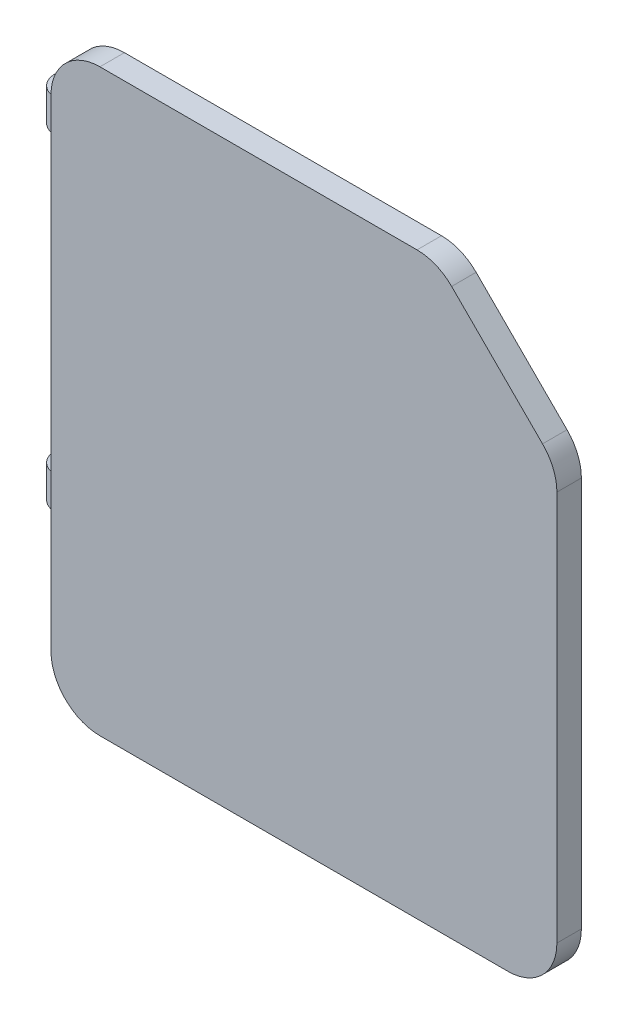
ISO-10303-21;
HEADER;
FILE_DESCRIPTION(('STEP AP214'),'2;1');
FILE_NAME('part.step','',(''),(''),'','','');
FILE_SCHEMA(('AUTOMOTIVE_DESIGN { 1 0 10303 214 1 1 1 1 }'));
ENDSEC;
DATA;
#1=APPLICATION_CONTEXT('core data for automotive mechanical design processes');
#2=APPLICATION_PROTOCOL_DEFINITION('international standard','automotive_design',2000,#1);
#3=PRODUCT_CONTEXT('',#1,'mechanical');
#4=PRODUCT('Part','Part','',(#3));
#5=PRODUCT_RELATED_PRODUCT_CATEGORY('part','',(#4));
#6=PRODUCT_DEFINITION_FORMATION('','',#4);
#7=PRODUCT_DEFINITION_CONTEXT('part definition',#1,'design');
#8=PRODUCT_DEFINITION('design','',#6,#7);
#9=PRODUCT_DEFINITION_SHAPE('','',#8);
#10=(LENGTH_UNIT() NAMED_UNIT(*) SI_UNIT(.MILLI.,.METRE.));
#11=(NAMED_UNIT(*) PLANE_ANGLE_UNIT() SI_UNIT($,.RADIAN.));
#12=(NAMED_UNIT(*) SI_UNIT($,.STERADIAN.) SOLID_ANGLE_UNIT());
#13=UNCERTAINTY_MEASURE_WITH_UNIT(LENGTH_MEASURE(1.E-05),#10,'distance_accuracy_value','');
#14=(GEOMETRIC_REPRESENTATION_CONTEXT(3) GLOBAL_UNCERTAINTY_ASSIGNED_CONTEXT((#13)) GLOBAL_UNIT_ASSIGNED_CONTEXT((#10,
#11,#12)) REPRESENTATION_CONTEXT('',''));
#15=CARTESIAN_POINT('',(0.,0.,0.));
#16=DIRECTION('',(0.,0.,1.));
#17=DIRECTION('',(1.,0.,0.));
#18=AXIS2_PLACEMENT_3D('',#15,#16,#17);
#19=CARTESIAN_POINT('',(0.,0.,0.));
#20=DIRECTION('',(0.,0.,1.));
#21=DIRECTION('',(1.,0.,0.));
#22=AXIS2_PLACEMENT_3D('',#19,#20,#21);
#23=PLANE('',#22);
#24=CARTESIAN_POINT('',(125.,-40.,0.));
#25=DIRECTION('',(0.,0.,1.));
#26=DIRECTION('',(1.,0.,0.));
#27=AXIS2_PLACEMENT_3D('',#24,#25,#26);
#28=CIRCLE('',#27,7.5);
#29=CARTESIAN_POINT('',(132.5,-40.,0.));
#30=VERTEX_POINT('',#29);
#31=EDGE_CURVE('E12',#30,#30,#28,.F.);
#32=ORIENTED_EDGE('',*,*,#31,.F.);
#33=EDGE_LOOP('',(#32));
#34=FACE_BOUND('',#33,.T.);
#35=CARTESIAN_POINT('',(125.,40.,0.));
#36=DIRECTION('',(0.,0.,1.));
#37=DIRECTION('',(1.,0.,0.));
#38=AXIS2_PLACEMENT_3D('',#35,#36,#37);
#39=CIRCLE('',#38,7.50000000000001);
#40=CARTESIAN_POINT('',(132.5,40.,0.));
#41=VERTEX_POINT('',#40);
#42=EDGE_CURVE('E107',#41,#41,#39,.F.);
#43=ORIENTED_EDGE('',*,*,#42,.F.);
#44=EDGE_LOOP('',(#43));
#45=FACE_BOUND('',#44,.T.);
#46=CARTESIAN_POINT('',(125.,69.2961173944452,0.));
#47=DIRECTION('',(0.,0.,-1.));
#48=DIRECTION('',(-1.,0.,0.));
#49=AXIS2_PLACEMENT_3D('',#46,#47,#48);
#50=CIRCLE('',#49,30.);
#51=CARTESIAN_POINT('',(146.213203435596,90.5093208300416,0.));
#52=VERTEX_POINT('',#51);
#53=CARTESIAN_POINT('',(155.,69.2961173944452,0.));
#54=VERTEX_POINT('',#53);
#55=EDGE_CURVE('E308',#52,#54,#50,.T.);
#56=ORIENTED_EDGE('',*,*,#55,.T.);
#57=DIRECTION('',(0.,1.,0.));
#58=VECTOR('',#57,1.);
#59=CARTESIAN_POINT('',(155.,0.,0.));
#60=LINE('',#59,#58);
#61=CARTESIAN_POINT('',(155.,-170.,0.));
#62=VERTEX_POINT('',#61);
#63=EDGE_CURVE('E399',#62,#54,#60,.T.);
#64=ORIENTED_EDGE('',*,*,#63,.F.);
#65=CARTESIAN_POINT('',(125.,-170.,0.));
#66=DIRECTION('',(0.,0.,-1.));
#67=DIRECTION('',(-1.,0.,0.));
#68=AXIS2_PLACEMENT_3D('',#65,#66,#67);
#69=CIRCLE('',#68,30.);
#70=CARTESIAN_POINT('',(125.,-200.,0.));
#71=VERTEX_POINT('',#70);
#72=EDGE_CURVE('E313',#71,#62,#69,.F.);
#73=ORIENTED_EDGE('',*,*,#72,.F.);
#74=DIRECTION('',(1.,0.,0.));
#75=VECTOR('',#74,1.);
#76=CARTESIAN_POINT('',(0.,-200.,0.));
#77=LINE('',#76,#75);
#78=CARTESIAN_POINT('',(-125.,-200.,0.));
#79=VERTEX_POINT('',#78);
#80=EDGE_CURVE('E407',#79,#71,#77,.T.);
#81=ORIENTED_EDGE('',*,*,#80,.F.);
#82=CARTESIAN_POINT('',(-125.,-170.,0.));
#83=DIRECTION('',(0.,0.,-1.));
#84=DIRECTION('',(-1.,0.,0.));
#85=AXIS2_PLACEMENT_3D('',#82,#83,#84);
#86=CIRCLE('',#85,30.);
#87=CARTESIAN_POINT('',(-155.,-170.,0.));
#88=VERTEX_POINT('',#87);
#89=EDGE_CURVE('E309',#88,#79,#86,.F.);
#90=ORIENTED_EDGE('',*,*,#89,.F.);
#91=DIRECTION('',(0.,1.,0.));
#92=VECTOR('',#91,1.);
#93=CARTESIAN_POINT('',(-155.,0.,0.));
#94=LINE('',#93,#92);
#95=CARTESIAN_POINT('',(-155.,-110.,0.));
#96=VERTEX_POINT('',#95);
#97=EDGE_CURVE('E429',#88,#96,#94,.T.);
#98=ORIENTED_EDGE('',*,*,#97,.T.);
#99=DIRECTION('',(-1.,0.,0.));
#100=VECTOR('',#99,1.);
#101=CARTESIAN_POINT('',(0.,-110.,0.));
#102=LINE('',#101,#100);
#103=CARTESIAN_POINT('',(-107.5,-110.,0.));
#104=VERTEX_POINT('',#103);
#105=EDGE_CURVE('E360',#104,#96,#102,.T.);
#106=ORIENTED_EDGE('',*,*,#105,.F.);
#107=DIRECTION('',(0.,1.,0.));
#108=VECTOR('',#107,1.);
#109=CARTESIAN_POINT('',(-107.5,-110.,0.));
#110=LINE('',#109,#108);
#111=CARTESIAN_POINT('',(-107.5,-90.,0.));
#112=VERTEX_POINT('',#111);
#113=EDGE_CURVE('E370',#104,#112,#110,.T.);
#114=ORIENTED_EDGE('',*,*,#113,.T.);
#115=DIRECTION('',(-1.,0.,0.));
#116=VECTOR('',#115,1.);
#117=CARTESIAN_POINT('',(0.,-90.,0.));
#118=LINE('',#117,#116);
#119=CARTESIAN_POINT('',(-155.,-90.,0.));
#120=VERTEX_POINT('',#119);
#121=EDGE_CURVE('E347',#112,#120,#118,.T.);
#122=ORIENTED_EDGE('',*,*,#121,.T.);
#123=CARTESIAN_POINT('',(-155.,90.,0.));
#124=VERTEX_POINT('',#123);
#125=EDGE_CURVE('E432',#120,#124,#94,.T.);
#126=ORIENTED_EDGE('',*,*,#125,.T.);
#127=DIRECTION('',(-1.,0.,0.));
#128=VECTOR('',#127,1.);
#129=CARTESIAN_POINT('',(0.,90.,0.));
#130=LINE('',#129,#128);
#131=CARTESIAN_POINT('',(-107.5,90.,0.));
#132=VERTEX_POINT('',#131);
#133=EDGE_CURVE('E438',#132,#124,#130,.T.);
#134=ORIENTED_EDGE('',*,*,#133,.F.);
#135=DIRECTION('',(0.,1.,0.));
#136=VECTOR('',#135,1.);
#137=CARTESIAN_POINT('',(-107.5,90.,0.));
#138=LINE('',#137,#136);
#139=CARTESIAN_POINT('',(-107.5,110.,0.));
#140=VERTEX_POINT('',#139);
#141=EDGE_CURVE('E396',#132,#140,#138,.T.);
#142=ORIENTED_EDGE('',*,*,#141,.T.);
#143=DIRECTION('',(-1.,0.,0.));
#144=VECTOR('',#143,1.);
#145=CARTESIAN_POINT('',(0.,110.,0.));
#146=LINE('',#145,#144);
#147=CARTESIAN_POINT('',(-155.,110.,0.));
#148=VERTEX_POINT('',#147);
#149=EDGE_CURVE('E419',#140,#148,#146,.T.);
#150=ORIENTED_EDGE('',*,*,#149,.T.);
#151=CARTESIAN_POINT('',(-155.,125.,0.));
#152=VERTEX_POINT('',#151);
#153=EDGE_CURVE('E428',#148,#152,#94,.T.);
#154=ORIENTED_EDGE('',*,*,#153,.T.);
#155=CARTESIAN_POINT('',(-125.,125.,0.));
#156=DIRECTION('',(0.,0.,-1.));
#157=DIRECTION('',(-1.,0.,0.));
#158=AXIS2_PLACEMENT_3D('',#155,#156,#157);
#159=CIRCLE('',#158,30.);
#160=CARTESIAN_POINT('',(-125.,155.,0.));
#161=VERTEX_POINT('',#160);
#162=EDGE_CURVE('E315',#161,#152,#159,.F.);
#163=ORIENTED_EDGE('',*,*,#162,.F.);
#164=DIRECTION('',(1.,0.,0.));
#165=VECTOR('',#164,1.);
#166=CARTESIAN_POINT('',(0.,155.,0.));
#167=LINE('',#166,#165);
#168=CARTESIAN_POINT('',(69.2961173944454,155.,0.));
#169=VERTEX_POINT('',#168);
#170=EDGE_CURVE('E425',#161,#169,#167,.T.);
#171=ORIENTED_EDGE('',*,*,#170,.T.);
#172=CARTESIAN_POINT('',(69.2961173944453,125.,0.));
#173=DIRECTION('',(0.,0.,-1.));
#174=DIRECTION('',(-1.,0.,0.));
#175=AXIS2_PLACEMENT_3D('',#172,#173,#174);
#176=CIRCLE('',#175,30.);
#177=CARTESIAN_POINT('',(90.5093208300418,146.213203435596,0.));
#178=VERTEX_POINT('',#177);
#179=EDGE_CURVE('E321',#178,#169,#176,.F.);
#180=ORIENTED_EDGE('',*,*,#179,.F.);
#181=DIRECTION('',(-0.707106781186547,0.707106781186548,0.));
#182=VECTOR('',#181,1.);
#183=CARTESIAN_POINT('',(118.361262132819,118.361262132819,0.));
#184=LINE('',#183,#182);
#185=EDGE_CURVE('E422',#52,#178,#184,.T.);
#186=ORIENTED_EDGE('',*,*,#185,.F.);
#187=EDGE_LOOP('',(#56,#64,#73,#81,#90,#98,#106,#114,#122,#126,#134,#142,#150,#154,#163,#171,
#180,#186));
#188=FACE_BOUND('',#187,.T.);
#189=ADVANCED_FACE('F99',(#34,#45,#188),#23,.F.);
#190=CARTESIAN_POINT('',(155.,0.,15.));
#191=DIRECTION('',(-1.,0.,0.));
#192=DIRECTION('',(0.,0.,1.));
#193=AXIS2_PLACEMENT_3D('',#190,#191,#192);
#194=PLANE('',#193);
#195=DIRECTION('',(0.,0.,-1.));
#196=VECTOR('',#195,1.);
#197=CARTESIAN_POINT('',(155.,69.2961173944452,46.));
#198=LINE('',#197,#196);
#199=CARTESIAN_POINT('',(155.,69.2961173944452,15.));
#200=VERTEX_POINT('',#199);
#201=EDGE_CURVE('E324',#200,#54,#198,.T.);
#202=ORIENTED_EDGE('',*,*,#201,.F.);
#203=DIRECTION('',(0.,1.,0.));
#204=VECTOR('',#203,1.);
#205=CARTESIAN_POINT('',(155.,0.,15.));
#206=LINE('',#205,#204);
#207=CARTESIAN_POINT('',(155.,-170.,15.));
#208=VERTEX_POINT('',#207);
#209=EDGE_CURVE('E403',#208,#200,#206,.T.);
#210=ORIENTED_EDGE('',*,*,#209,.F.);
#211=DIRECTION('',(0.,0.,-1.));
#212=VECTOR('',#211,1.);
#213=CARTESIAN_POINT('',(155.,-170.,46.));
#214=LINE('',#213,#212);
#215=EDGE_CURVE('E336',#208,#62,#214,.T.);
#216=ORIENTED_EDGE('',*,*,#215,.T.);
#217=ORIENTED_EDGE('',*,*,#63,.T.);
#218=EDGE_LOOP('',(#202,#210,#216,#217));
#219=FACE_BOUND('',#218,.T.);
#220=ADVANCED_FACE('F101',(#219),#194,.F.);
#221=CARTESIAN_POINT('',(0.,155.,15.));
#222=DIRECTION('',(0.,1.,0.));
#223=DIRECTION('',(0.,0.,1.));
#224=AXIS2_PLACEMENT_3D('',#221,#222,#223);
#225=PLANE('',#224);
#226=DIRECTION('',(0.,0.,-1.));
#227=VECTOR('',#226,1.);
#228=CARTESIAN_POINT('',(69.2961173944454,155.,46.));
#229=LINE('',#228,#227);
#230=CARTESIAN_POINT('',(69.2961173944453,155.,15.));
#231=VERTEX_POINT('',#230);
#232=EDGE_CURVE('E318',#231,#169,#229,.T.);
#233=ORIENTED_EDGE('',*,*,#232,.T.);
#234=ORIENTED_EDGE('',*,*,#170,.F.);
#235=DIRECTION('',(0.,0.,-1.));
#236=VECTOR('',#235,1.);
#237=CARTESIAN_POINT('',(-125.,155.,46.));
#238=LINE('',#237,#236);
#239=CARTESIAN_POINT('',(-125.,155.,15.));
#240=VERTEX_POINT('',#239);
#241=EDGE_CURVE('E317',#240,#161,#238,.T.);
#242=ORIENTED_EDGE('',*,*,#241,.F.);
#243=DIRECTION('',(1.,0.,0.));
#244=VECTOR('',#243,1.);
#245=CARTESIAN_POINT('',(0.,155.,15.));
#246=LINE('',#245,#244);
#247=EDGE_CURVE('E410',#240,#231,#246,.T.);
#248=ORIENTED_EDGE('',*,*,#247,.T.);
#249=EDGE_LOOP('',(#233,#234,#242,#248));
#250=FACE_BOUND('',#249,.T.);
#251=ADVANCED_FACE('F549',(#250),#225,.T.);
#252=CARTESIAN_POINT('',(-155.,0.,15.));
#253=DIRECTION('',(-1.,0.,0.));
#254=DIRECTION('',(0.,0.,1.));
#255=AXIS2_PLACEMENT_3D('',#252,#253,#254);
#256=PLANE('',#255);
#257=DIRECTION('',(0.,0.,-1.));
#258=VECTOR('',#257,1.);
#259=CARTESIAN_POINT('',(-155.,125.,46.));
#260=LINE('',#259,#258);
#261=CARTESIAN_POINT('',(-155.,125.,15.));
#262=VERTEX_POINT('',#261);
#263=EDGE_CURVE('E122',#262,#152,#260,.T.);
#264=ORIENTED_EDGE('',*,*,#263,.T.);
#265=ORIENTED_EDGE('',*,*,#153,.F.);
#266=EDGE_CURVE('E433',#124,#148,#94,.T.);
#267=ORIENTED_EDGE('',*,*,#266,.F.);
#268=ORIENTED_EDGE('',*,*,#125,.F.);
#269=EDGE_CURVE('E431',#96,#120,#94,.T.);
#270=ORIENTED_EDGE('',*,*,#269,.F.);
#271=ORIENTED_EDGE('',*,*,#97,.F.);
#272=DIRECTION('',(0.,0.,-1.));
#273=VECTOR('',#272,1.);
#274=CARTESIAN_POINT('',(-155.,-170.,46.));
#275=LINE('',#274,#273);
#276=CARTESIAN_POINT('',(-155.,-170.,15.));
#277=VERTEX_POINT('',#276);
#278=EDGE_CURVE('E311',#277,#88,#275,.T.);
#279=ORIENTED_EDGE('',*,*,#278,.F.);
#280=DIRECTION('',(0.,1.,0.));
#281=VECTOR('',#280,1.);
#282=CARTESIAN_POINT('',(-155.,0.,15.));
#283=LINE('',#282,#281);
#284=EDGE_CURVE('E413',#277,#262,#283,.T.);
#285=ORIENTED_EDGE('',*,*,#284,.T.);
#286=EDGE_LOOP('',(#264,#265,#267,#268,#270,#271,#279,#285));
#287=FACE_BOUND('',#286,.T.);
#288=ADVANCED_FACE('F484',(#287),#256,.T.);
#289=CARTESIAN_POINT('',(0.,-200.,15.));
#290=DIRECTION('',(0.,1.,0.));
#291=DIRECTION('',(0.,0.,1.));
#292=AXIS2_PLACEMENT_3D('',#289,#290,#291);
#293=PLANE('',#292);
#294=DIRECTION('',(0.,0.,-1.));
#295=VECTOR('',#294,1.);
#296=CARTESIAN_POINT('',(-125.,-200.,46.));
#297=LINE('',#296,#295);
#298=CARTESIAN_POINT('',(-125.,-200.,15.));
#299=VERTEX_POINT('',#298);
#300=EDGE_CURVE('E114',#299,#79,#297,.T.);
#301=ORIENTED_EDGE('',*,*,#300,.T.);
#302=ORIENTED_EDGE('',*,*,#80,.T.);
#303=DIRECTION('',(0.,0.,-1.));
#304=VECTOR('',#303,1.);
#305=CARTESIAN_POINT('',(125.,-200.,46.));
#306=LINE('',#305,#304);
#307=CARTESIAN_POINT('',(125.,-200.,15.));
#308=VERTEX_POINT('',#307);
#309=EDGE_CURVE('E335',#308,#71,#306,.T.);
#310=ORIENTED_EDGE('',*,*,#309,.F.);
#311=DIRECTION('',(1.,0.,0.));
#312=VECTOR('',#311,1.);
#313=CARTESIAN_POINT('',(0.,-200.,15.));
#314=LINE('',#313,#312);
#315=EDGE_CURVE('E416',#299,#308,#314,.T.);
#316=ORIENTED_EDGE('',*,*,#315,.F.);
#317=EDGE_LOOP('',(#301,#302,#310,#316));
#318=FACE_BOUND('',#317,.T.);
#319=ADVANCED_FACE('F477',(#318),#293,.F.);
#320=CARTESIAN_POINT('',(0.,0.,15.));
#321=DIRECTION('',(0.,0.,1.));
#322=DIRECTION('',(1.,0.,0.));
#323=AXIS2_PLACEMENT_3D('',#320,#321,#322);
#324=PLANE('',#323);
#325=ORIENTED_EDGE('',*,*,#209,.T.);
#326=CARTESIAN_POINT('',(125.,69.2961173944452,15.));
#327=DIRECTION('',(0.,0.,1.));
#328=DIRECTION('',(1.,0.,0.));
#329=AXIS2_PLACEMENT_3D('',#326,#327,#328);
#330=CIRCLE('',#329,30.);
#331=CARTESIAN_POINT('',(146.213203435596,90.5093208300416,15.));
#332=VERTEX_POINT('',#331);
#333=EDGE_CURVE('E449',#200,#332,#330,.T.);
#334=ORIENTED_EDGE('',*,*,#333,.T.);
#335=DIRECTION('',(-0.707106781186547,0.707106781186548,0.));
#336=VECTOR('',#335,1.);
#337=CARTESIAN_POINT('',(118.361262132819,118.361262132819,15.));
#338=LINE('',#337,#336);
#339=CARTESIAN_POINT('',(90.5093208300418,146.213203435596,15.));
#340=VERTEX_POINT('',#339);
#341=EDGE_CURVE('E406',#332,#340,#338,.T.);
#342=ORIENTED_EDGE('',*,*,#341,.T.);
#343=CARTESIAN_POINT('',(69.2961173944453,125.,15.));
#344=DIRECTION('',(0.,0.,1.));
#345=DIRECTION('',(1.,0.,0.));
#346=AXIS2_PLACEMENT_3D('',#343,#344,#345);
#347=CIRCLE('',#346,30.);
#348=EDGE_CURVE('E447',#231,#340,#347,.F.);
#349=ORIENTED_EDGE('',*,*,#348,.F.);
#350=ORIENTED_EDGE('',*,*,#247,.F.);
#351=CARTESIAN_POINT('',(-125.,125.,15.));
#352=DIRECTION('',(0.,0.,1.));
#353=DIRECTION('',(1.,0.,0.));
#354=AXIS2_PLACEMENT_3D('',#351,#352,#353);
#355=CIRCLE('',#354,30.);
#356=EDGE_CURVE('E445',#262,#240,#355,.F.);
#357=ORIENTED_EDGE('',*,*,#356,.F.);
#358=ORIENTED_EDGE('',*,*,#284,.F.);
#359=CARTESIAN_POINT('',(-125.,-170.,15.));
#360=DIRECTION('',(0.,0.,1.));
#361=DIRECTION('',(1.,0.,0.));
#362=AXIS2_PLACEMENT_3D('',#359,#360,#361);
#363=CIRCLE('',#362,30.);
#364=EDGE_CURVE('E443',#299,#277,#363,.F.);
#365=ORIENTED_EDGE('',*,*,#364,.F.);
#366=ORIENTED_EDGE('',*,*,#315,.T.);
#367=CARTESIAN_POINT('',(125.,-170.,15.));
#368=DIRECTION('',(0.,0.,1.));
#369=DIRECTION('',(1.,0.,0.));
#370=AXIS2_PLACEMENT_3D('',#367,#368,#369);
#371=CIRCLE('',#370,30.);
#372=EDGE_CURVE('E441',#208,#308,#371,.F.);
#373=ORIENTED_EDGE('',*,*,#372,.F.);
#374=EDGE_LOOP('',(#325,#334,#342,#349,#350,#357,#358,#365,#366,#373));
#375=FACE_BOUND('',#374,.T.);
#376=ADVANCED_FACE('F473',(#375),#324,.T.);
#377=CARTESIAN_POINT('',(118.361262132819,118.361262132819,15.));
#378=DIRECTION('',(-0.707106781186549,-0.707106781186547,0.));
#379=DIRECTION('',(0.707106781186547,-0.707106781186549,0.));
#380=AXIS2_PLACEMENT_3D('',#377,#378,#379);
#381=PLANE('',#380);
#382=ORIENTED_EDGE('',*,*,#341,.F.);
#383=DIRECTION('',(0.,0.,-1.));
#384=VECTOR('',#383,1.);
#385=CARTESIAN_POINT('',(146.213203435596,90.5093208300416,46.));
#386=LINE('',#385,#384);
#387=EDGE_CURVE('E330',#332,#52,#386,.T.);
#388=ORIENTED_EDGE('',*,*,#387,.T.);
#389=ORIENTED_EDGE('',*,*,#185,.T.);
#390=DIRECTION('',(0.,0.,-1.));
#391=VECTOR('',#390,1.);
#392=CARTESIAN_POINT('',(90.5093208300418,146.213203435596,46.));
#393=LINE('',#392,#391);
#394=EDGE_CURVE('E323',#340,#178,#393,.T.);
#395=ORIENTED_EDGE('',*,*,#394,.F.);
#396=EDGE_LOOP('',(#382,#388,#389,#395));
#397=FACE_BOUND('',#396,.T.);
#398=ADVANCED_FACE('F541',(#397),#381,.F.);
#399=CARTESIAN_POINT('',(-17.1428096821437,90.,39.357033895255));
#400=DIRECTION('',(-0.399334442595674,0.,0.916805324459235));
#401=DIRECTION('',(0.916805324459235,0.,0.399334442595674));
#402=AXIS2_PLACEMENT_3D('',#399,#400,#401);
#403=PLANE('',#402);
#404=DIRECTION('',(0.,1.,0.));
#405=VECTOR('',#404,1.);
#406=CARTESIAN_POINT('',(-162.508319467554,90.,-23.9600665557404));
#407=LINE('',#406,#405);
#408=CARTESIAN_POINT('',(-162.508319467554,90.,-23.9600665557404));
#409=VERTEX_POINT('',#408);
#410=CARTESIAN_POINT('',(-162.508319467554,110.,-23.9600665557404));
#411=VERTEX_POINT('',#410);
#412=EDGE_CURVE('E395',#409,#411,#407,.T.);
#413=ORIENTED_EDGE('',*,*,#412,.T.);
#414=DIRECTION('',(0.916805324459235,0.,0.399334442595674));
#415=VECTOR('',#414,1.);
#416=CARTESIAN_POINT('',(-17.1428096821437,110.,39.357033895255));
#417=LINE('',#416,#415);
#418=EDGE_CURVE('E369',#411,#140,#417,.T.);
#419=ORIENTED_EDGE('',*,*,#418,.T.);
#420=ORIENTED_EDGE('',*,*,#141,.F.);
#421=DIRECTION('',(0.916805324459235,0.,0.399334442595674));
#422=VECTOR('',#421,1.);
#423=CARTESIAN_POINT('',(-17.1428096821437,90.,39.357033895255));
#424=LINE('',#423,#422);
#425=EDGE_CURVE('E384',#409,#132,#424,.T.);
#426=ORIENTED_EDGE('',*,*,#425,.F.);
#427=EDGE_LOOP('',(#413,#419,#420,#426));
#428=FACE_BOUND('',#427,.T.);
#429=ADVANCED_FACE('F534',(#428),#403,.F.);
#430=CARTESIAN_POINT('',(0.,90.,0.));
#431=DIRECTION('',(0.,0.,1.));
#432=DIRECTION('',(1.,0.,0.));
#433=AXIS2_PLACEMENT_3D('',#430,#431,#432);
#434=PLANE('',#433);
#435=DIRECTION('',(1.,0.,0.));
#436=VECTOR('',#435,1.);
#437=CARTESIAN_POINT('',(0.,90.,0.));
#438=LINE('',#437,#436);
#439=CARTESIAN_POINT('',(-167.5,90.,0.));
#440=VERTEX_POINT('',#439);
#441=EDGE_CURVE('E389',#440,#124,#438,.T.);
#442=ORIENTED_EDGE('',*,*,#441,.T.);
#443=ORIENTED_EDGE('',*,*,#266,.T.);
#444=DIRECTION('',(1.,0.,0.));
#445=VECTOR('',#444,1.);
#446=CARTESIAN_POINT('',(0.,110.,0.));
#447=LINE('',#446,#445);
#448=CARTESIAN_POINT('',(-167.5,110.,0.));
#449=VERTEX_POINT('',#448);
#450=EDGE_CURVE('E379',#449,#148,#447,.T.);
#451=ORIENTED_EDGE('',*,*,#450,.F.);
#452=DIRECTION('',(0.,1.,0.));
#453=VECTOR('',#452,1.);
#454=CARTESIAN_POINT('',(-167.5,90.,0.));
#455=LINE('',#454,#453);
#456=EDGE_CURVE('E400',#440,#449,#455,.T.);
#457=ORIENTED_EDGE('',*,*,#456,.F.);
#458=EDGE_LOOP('',(#442,#443,#451,#457));
#459=FACE_BOUND('',#458,.T.);
#460=ADVANCED_FACE('F531',(#459),#434,.T.);
#461=CARTESIAN_POINT('',(-167.5,90.,-12.5));
#462=DIRECTION('',(0.,1.,0.));
#463=DIRECTION('',(0.,0.,1.));
#464=AXIS2_PLACEMENT_3D('',#461,#462,#463);
#465=CYLINDRICAL_SURFACE('',#464,12.5);
#466=ORIENTED_EDGE('',*,*,#456,.T.);
#467=CARTESIAN_POINT('',(-167.5,110.,-12.5));
#468=DIRECTION('',(0.,1.,0.));
#469=DIRECTION('',(0.,0.,1.));
#470=AXIS2_PLACEMENT_3D('',#467,#468,#469);
#471=CIRCLE('',#470,12.5);
#472=EDGE_CURVE('E376',#411,#449,#471,.T.);
#473=ORIENTED_EDGE('',*,*,#472,.F.);
#474=ORIENTED_EDGE('',*,*,#412,.F.);
#475=CARTESIAN_POINT('',(-167.5,90.,-12.5));
#476=DIRECTION('',(0.,1.,0.));
#477=DIRECTION('',(0.,0.,1.));
#478=AXIS2_PLACEMENT_3D('',#475,#476,#477);
#479=CIRCLE('',#478,12.5);
#480=EDGE_CURVE('E386',#409,#440,#479,.T.);
#481=ORIENTED_EDGE('',*,*,#480,.T.);
#482=EDGE_LOOP('',(#466,#473,#474,#481));
#483=FACE_BOUND('',#482,.T.);
#484=ADVANCED_FACE('F529',(#483),#465,.T.);
#485=CARTESIAN_POINT('',(-167.5,90.,-12.5));
#486=DIRECTION('',(0.,1.,0.));
#487=DIRECTION('',(0.,0.,1.));
#488=AXIS2_PLACEMENT_3D('',#485,#486,#487);
#489=CYLINDRICAL_SURFACE('',#488,10.);
#490=CARTESIAN_POINT('',(-167.5,90.,-12.5));
#491=DIRECTION('',(0.,1.,0.));
#492=DIRECTION('',(0.,0.,1.));
#493=AXIS2_PLACEMENT_3D('',#490,#491,#492);
#494=CIRCLE('',#493,10.);
#495=CARTESIAN_POINT('',(-167.5,90.,-2.49999999999999));
#496=VERTEX_POINT('',#495);
#497=EDGE_CURVE('E392',#496,#496,#494,.T.);
#498=ORIENTED_EDGE('',*,*,#497,.F.);
#499=EDGE_LOOP('',(#498));
#500=FACE_BOUND('',#499,.T.);
#501=CARTESIAN_POINT('',(-167.5,110.,-12.5));
#502=DIRECTION('',(0.,1.,0.));
#503=DIRECTION('',(0.,0.,1.));
#504=AXIS2_PLACEMENT_3D('',#501,#502,#503);
#505=CIRCLE('',#504,10.);
#506=CARTESIAN_POINT('',(-167.5,110.,-2.49999999999999));
#507=VERTEX_POINT('',#506);
#508=EDGE_CURVE('E381',#507,#507,#505,.T.);
#509=ORIENTED_EDGE('',*,*,#508,.T.);
#510=EDGE_LOOP('',(#509));
#511=FACE_BOUND('',#510,.T.);
#512=ADVANCED_FACE('F525',(#500,#511),#489,.F.);
#513=CARTESIAN_POINT('',(0.,90.,0.));
#514=DIRECTION('',(0.,1.,0.));
#515=DIRECTION('',(0.,0.,1.));
#516=AXIS2_PLACEMENT_3D('',#513,#514,#515);
#517=PLANE('',#516);
#518=ORIENTED_EDGE('',*,*,#480,.F.);
#519=ORIENTED_EDGE('',*,*,#425,.T.);
#520=ORIENTED_EDGE('',*,*,#133,.T.);
#521=ORIENTED_EDGE('',*,*,#441,.F.);
#522=EDGE_LOOP('',(#518,#519,#520,#521));
#523=FACE_BOUND('',#522,.T.);
#524=ORIENTED_EDGE('',*,*,#497,.T.);
#525=EDGE_LOOP('',(#524));
#526=FACE_BOUND('',#525,.T.);
#527=ADVANCED_FACE('F515',(#523,#526),#517,.F.);
#528=CARTESIAN_POINT('',(0.,110.,0.));
#529=DIRECTION('',(0.,1.,0.));
#530=DIRECTION('',(0.,0.,1.));
#531=AXIS2_PLACEMENT_3D('',#528,#529,#530);
#532=PLANE('',#531);
#533=ORIENTED_EDGE('',*,*,#472,.T.);
#534=ORIENTED_EDGE('',*,*,#450,.T.);
#535=ORIENTED_EDGE('',*,*,#149,.F.);
#536=ORIENTED_EDGE('',*,*,#418,.F.);
#537=EDGE_LOOP('',(#533,#534,#535,#536));
#538=FACE_BOUND('',#537,.T.);
#539=ORIENTED_EDGE('',*,*,#508,.F.);
#540=EDGE_LOOP('',(#539));
#541=FACE_BOUND('',#540,.T.);
#542=ADVANCED_FACE('F507',(#538,#541),#532,.T.);
#543=CARTESIAN_POINT('',(-167.5,-110.,-12.5));
#544=DIRECTION('',(0.,1.,0.));
#545=DIRECTION('',(0.,0.,1.));
#546=AXIS2_PLACEMENT_3D('',#543,#544,#545);
#547=CYLINDRICAL_SURFACE('',#546,12.5);
#548=DIRECTION('',(0.,1.,0.));
#549=VECTOR('',#548,1.);
#550=CARTESIAN_POINT('',(-167.5,-110.,0.));
#551=LINE('',#550,#549);
#552=CARTESIAN_POINT('',(-167.5,-110.,0.));
#553=VERTEX_POINT('',#552);
#554=CARTESIAN_POINT('',(-167.5,-90.,0.));
#555=VERTEX_POINT('',#554);
#556=EDGE_CURVE('E366',#553,#555,#551,.T.);
#557=ORIENTED_EDGE('',*,*,#556,.T.);
#558=CARTESIAN_POINT('',(-167.5,-90.,-12.5));
#559=DIRECTION('',(0.,1.,0.));
#560=DIRECTION('',(0.,0.,1.));
#561=AXIS2_PLACEMENT_3D('',#558,#559,#560);
#562=CIRCLE('',#561,12.5);
#563=CARTESIAN_POINT('',(-162.508319467554,-90.,-23.9600665557404));
#564=VERTEX_POINT('',#563);
#565=EDGE_CURVE('E343',#564,#555,#562,.T.);
#566=ORIENTED_EDGE('',*,*,#565,.F.);
#567=DIRECTION('',(0.,1.,0.));
#568=VECTOR('',#567,1.);
#569=CARTESIAN_POINT('',(-162.508319467554,-110.,-23.9600665557404));
#570=LINE('',#569,#568);
#571=CARTESIAN_POINT('',(-162.508319467554,-110.,-23.9600665557404));
#572=VERTEX_POINT('',#571);
#573=EDGE_CURVE('E367',#572,#564,#570,.T.);
#574=ORIENTED_EDGE('',*,*,#573,.F.);
#575=CARTESIAN_POINT('',(-167.5,-110.,-12.5));
#576=DIRECTION('',(0.,1.,0.));
#577=DIRECTION('',(0.,0.,1.));
#578=AXIS2_PLACEMENT_3D('',#575,#576,#577);
#579=CIRCLE('',#578,12.5);
#580=EDGE_CURVE('E356',#572,#553,#579,.T.);
#581=ORIENTED_EDGE('',*,*,#580,.T.);
#582=EDGE_LOOP('',(#557,#566,#574,#581));
#583=FACE_BOUND('',#582,.T.);
#584=ADVANCED_FACE('F505',(#583),#547,.T.);
#585=CARTESIAN_POINT('',(-17.1428096821437,-110.,39.357033895255));
#586=DIRECTION('',(-0.399334442595674,0.,0.916805324459235));
#587=DIRECTION('',(0.916805324459235,0.,0.399334442595674));
#588=AXIS2_PLACEMENT_3D('',#585,#586,#587);
#589=PLANE('',#588);
#590=ORIENTED_EDGE('',*,*,#573,.T.);
#591=DIRECTION('',(0.916805324459235,0.,0.399334442595674));
#592=VECTOR('',#591,1.);
#593=CARTESIAN_POINT('',(-17.1428096821437,-90.,39.357033895255));
#594=LINE('',#593,#592);
#595=EDGE_CURVE('E350',#564,#112,#594,.T.);
#596=ORIENTED_EDGE('',*,*,#595,.T.);
#597=ORIENTED_EDGE('',*,*,#113,.F.);
#598=DIRECTION('',(0.916805324459235,0.,0.399334442595674));
#599=VECTOR('',#598,1.);
#600=CARTESIAN_POINT('',(-17.1428096821437,-110.,39.357033895255));
#601=LINE('',#600,#599);
#602=EDGE_CURVE('E363',#572,#104,#601,.T.);
#603=ORIENTED_EDGE('',*,*,#602,.F.);
#604=EDGE_LOOP('',(#590,#596,#597,#603));
#605=FACE_BOUND('',#604,.T.);
#606=ADVANCED_FACE('F502',(#605),#589,.F.);
#607=CARTESIAN_POINT('',(-167.5,-110.,-12.5));
#608=DIRECTION('',(0.,1.,0.));
#609=DIRECTION('',(0.,0.,1.));
#610=AXIS2_PLACEMENT_3D('',#607,#608,#609);
#611=CYLINDRICAL_SURFACE('',#610,10.);
#612=CARTESIAN_POINT('',(-167.5,-110.,-12.5));
#613=DIRECTION('',(0.,1.,0.));
#614=DIRECTION('',(0.,0.,1.));
#615=AXIS2_PLACEMENT_3D('',#612,#613,#614);
#616=CIRCLE('',#615,10.);
#617=CARTESIAN_POINT('',(-167.5,-110.,-2.49999999999998));
#618=VERTEX_POINT('',#617);
#619=EDGE_CURVE('E353',#618,#618,#616,.T.);
#620=ORIENTED_EDGE('',*,*,#619,.F.);
#621=EDGE_LOOP('',(#620));
#622=FACE_BOUND('',#621,.T.);
#623=CARTESIAN_POINT('',(-167.5,-90.,-12.5));
#624=DIRECTION('',(0.,1.,0.));
#625=DIRECTION('',(0.,0.,1.));
#626=AXIS2_PLACEMENT_3D('',#623,#624,#625);
#627=CIRCLE('',#626,10.);
#628=CARTESIAN_POINT('',(-167.5,-90.,-2.49999999999998));
#629=VERTEX_POINT('',#628);
#630=EDGE_CURVE('E339',#629,#629,#627,.T.);
#631=ORIENTED_EDGE('',*,*,#630,.T.);
#632=EDGE_LOOP('',(#631));
#633=FACE_BOUND('',#632,.T.);
#634=ADVANCED_FACE('F513',(#622,#633),#611,.F.);
#635=CARTESIAN_POINT('',(0.,-110.,0.));
#636=DIRECTION('',(0.,0.,-1.));
#637=DIRECTION('',(-1.,0.,0.));
#638=AXIS2_PLACEMENT_3D('',#635,#636,#637);
#639=PLANE('',#638);
#640=ORIENTED_EDGE('',*,*,#269,.T.);
#641=EDGE_CURVE('E346',#120,#555,#118,.T.);
#642=ORIENTED_EDGE('',*,*,#641,.T.);
#643=ORIENTED_EDGE('',*,*,#556,.F.);
#644=EDGE_CURVE('E359',#96,#553,#102,.T.);
#645=ORIENTED_EDGE('',*,*,#644,.F.);
#646=EDGE_LOOP('',(#640,#642,#643,#645));
#647=FACE_BOUND('',#646,.T.);
#648=ADVANCED_FACE('F491',(#647),#639,.F.);
#649=CARTESIAN_POINT('',(0.,-110.,0.));
#650=DIRECTION('',(0.,1.,0.));
#651=DIRECTION('',(0.,0.,1.));
#652=AXIS2_PLACEMENT_3D('',#649,#650,#651);
#653=PLANE('',#652);
#654=ORIENTED_EDGE('',*,*,#619,.T.);
#655=EDGE_LOOP('',(#654));
#656=FACE_BOUND('',#655,.T.);
#657=ORIENTED_EDGE('',*,*,#580,.F.);
#658=ORIENTED_EDGE('',*,*,#602,.T.);
#659=ORIENTED_EDGE('',*,*,#105,.T.);
#660=ORIENTED_EDGE('',*,*,#644,.T.);
#661=EDGE_LOOP('',(#657,#658,#659,#660));
#662=FACE_BOUND('',#661,.T.);
#663=ADVANCED_FACE('F494',(#656,#662),#653,.F.);
#664=CARTESIAN_POINT('',(0.,-90.,0.));
#665=DIRECTION('',(0.,1.,0.));
#666=DIRECTION('',(0.,0.,1.));
#667=AXIS2_PLACEMENT_3D('',#664,#665,#666);
#668=PLANE('',#667);
#669=ORIENTED_EDGE('',*,*,#630,.F.);
#670=EDGE_LOOP('',(#669));
#671=FACE_BOUND('',#670,.T.);
#672=ORIENTED_EDGE('',*,*,#565,.T.);
#673=ORIENTED_EDGE('',*,*,#641,.F.);
#674=ORIENTED_EDGE('',*,*,#121,.F.);
#675=ORIENTED_EDGE('',*,*,#595,.F.);
#676=EDGE_LOOP('',(#672,#673,#674,#675));
#677=FACE_BOUND('',#676,.T.);
#678=ADVANCED_FACE('F501',(#671,#677),#668,.T.);
#679=CARTESIAN_POINT('',(125.,-170.,46.));
#680=DIRECTION('',(0.,0.,-1.));
#681=DIRECTION('',(-1.,0.,0.));
#682=AXIS2_PLACEMENT_3D('',#679,#680,#681);
#683=CYLINDRICAL_SURFACE('',#682,30.);
#684=ORIENTED_EDGE('',*,*,#372,.T.);
#685=ORIENTED_EDGE('',*,*,#309,.T.);
#686=ORIENTED_EDGE('',*,*,#72,.T.);
#687=ORIENTED_EDGE('',*,*,#215,.F.);
#688=EDGE_LOOP('',(#684,#685,#686,#687));
#689=FACE_BOUND('',#688,.T.);
#690=ADVANCED_FACE('F470',(#689),#683,.T.);
#691=CARTESIAN_POINT('',(-125.,-170.,46.));
#692=DIRECTION('',(0.,0.,-1.));
#693=DIRECTION('',(-1.,0.,0.));
#694=AXIS2_PLACEMENT_3D('',#691,#692,#693);
#695=CYLINDRICAL_SURFACE('',#694,30.);
#696=ORIENTED_EDGE('',*,*,#364,.T.);
#697=ORIENTED_EDGE('',*,*,#278,.T.);
#698=ORIENTED_EDGE('',*,*,#89,.T.);
#699=ORIENTED_EDGE('',*,*,#300,.F.);
#700=EDGE_LOOP('',(#696,#697,#698,#699));
#701=FACE_BOUND('',#700,.T.);
#702=ADVANCED_FACE('F578',(#701),#695,.T.);
#703=CARTESIAN_POINT('',(-125.,125.,46.));
#704=DIRECTION('',(0.,0.,-1.));
#705=DIRECTION('',(-1.,0.,0.));
#706=AXIS2_PLACEMENT_3D('',#703,#704,#705);
#707=CYLINDRICAL_SURFACE('',#706,30.);
#708=ORIENTED_EDGE('',*,*,#356,.T.);
#709=ORIENTED_EDGE('',*,*,#241,.T.);
#710=ORIENTED_EDGE('',*,*,#162,.T.);
#711=ORIENTED_EDGE('',*,*,#263,.F.);
#712=EDGE_LOOP('',(#708,#709,#710,#711));
#713=FACE_BOUND('',#712,.T.);
#714=ADVANCED_FACE('F571',(#713),#707,.T.);
#715=CARTESIAN_POINT('',(69.2961173944453,125.,46.));
#716=DIRECTION('',(0.,0.,-1.));
#717=DIRECTION('',(-1.,0.,0.));
#718=AXIS2_PLACEMENT_3D('',#715,#716,#717);
#719=CYLINDRICAL_SURFACE('',#718,30.);
#720=ORIENTED_EDGE('',*,*,#348,.T.);
#721=ORIENTED_EDGE('',*,*,#394,.T.);
#722=ORIENTED_EDGE('',*,*,#179,.T.);
#723=ORIENTED_EDGE('',*,*,#232,.F.);
#724=EDGE_LOOP('',(#720,#721,#722,#723));
#725=FACE_BOUND('',#724,.T.);
#726=ADVANCED_FACE('F562',(#725),#719,.T.);
#727=CARTESIAN_POINT('',(125.,69.2961173944452,46.));
#728=DIRECTION('',(0.,0.,-1.));
#729=DIRECTION('',(-1.,0.,0.));
#730=AXIS2_PLACEMENT_3D('',#727,#728,#729);
#731=CYLINDRICAL_SURFACE('',#730,30.);
#732=ORIENTED_EDGE('',*,*,#201,.T.);
#733=ORIENTED_EDGE('',*,*,#55,.F.);
#734=ORIENTED_EDGE('',*,*,#387,.F.);
#735=ORIENTED_EDGE('',*,*,#333,.F.);
#736=EDGE_LOOP('',(#732,#733,#734,#735));
#737=FACE_BOUND('',#736,.T.);
#738=ADVANCED_FACE('F560',(#737),#731,.T.);
#739=CARTESIAN_POINT('',(125.,40.,-10.));
#740=DIRECTION('',(0.,0.,1.));
#741=DIRECTION('',(1.,0.,0.));
#742=AXIS2_PLACEMENT_3D('',#739,#740,#741);
#743=CYLINDRICAL_SURFACE('',#742,7.50000000000001);
#744=CARTESIAN_POINT('',(125.,40.,-10.));
#745=DIRECTION('',(0.,0.,-1.));
#746=DIRECTION('',(-1.,0.,0.));
#747=AXIS2_PLACEMENT_3D('',#744,#745,#746);
#748=CIRCLE('',#747,7.50000000000001);
#749=CARTESIAN_POINT('',(117.5,40.,-10.));
#750=VERTEX_POINT('',#749);
#751=EDGE_CURVE('E300',#750,#750,#748,.T.);
#752=ORIENTED_EDGE('',*,*,#751,.F.);
#753=EDGE_LOOP('',(#752));
#754=FACE_BOUND('',#753,.T.);
#755=ORIENTED_EDGE('',*,*,#42,.T.);
#756=EDGE_LOOP('',(#755));
#757=FACE_BOUND('',#756,.T.);
#758=ADVANCED_FACE('F454',(#754,#757),#743,.T.);
#759=CARTESIAN_POINT('',(125.,-40.,-10.));
#760=DIRECTION('',(0.,0.,1.));
#761=DIRECTION('',(1.,0.,0.));
#762=AXIS2_PLACEMENT_3D('',#759,#760,#761);
#763=CYLINDRICAL_SURFACE('',#762,7.5);
#764=CARTESIAN_POINT('',(125.,-40.,-10.));
#765=DIRECTION('',(0.,0.,-1.));
#766=DIRECTION('',(-1.,0.,0.));
#767=AXIS2_PLACEMENT_3D('',#764,#765,#766);
#768=CIRCLE('',#767,7.5);
#769=CARTESIAN_POINT('',(117.5,-40.,-10.));
#770=VERTEX_POINT('',#769);
#771=EDGE_CURVE('E297',#770,#770,#768,.T.);
#772=ORIENTED_EDGE('',*,*,#771,.F.);
#773=EDGE_LOOP('',(#772));
#774=FACE_BOUND('',#773,.T.);
#775=ORIENTED_EDGE('',*,*,#31,.T.);
#776=EDGE_LOOP('',(#775));
#777=FACE_BOUND('',#776,.T.);
#778=ADVANCED_FACE('F568',(#774,#777),#763,.T.);
#779=CARTESIAN_POINT('',(120.,-45.,-15.));
#780=DIRECTION('',(0.,0.,1.));
#781=DIRECTION('',(1.,0.,0.));
#782=AXIS2_PLACEMENT_3D('',#779,#780,#781);
#783=CYLINDRICAL_SURFACE('',#782,5.);
#784=CARTESIAN_POINT('',(120.,-45.,-10.));
#785=DIRECTION('',(0.,0.,-1.));
#786=DIRECTION('',(-1.,0.,0.));
#787=AXIS2_PLACEMENT_3D('',#784,#785,#786);
#788=CIRCLE('',#787,5.);
#789=CARTESIAN_POINT('',(120.,-50.,-10.));
#790=VERTEX_POINT('',#789);
#791=CARTESIAN_POINT('',(115.,-45.,-10.));
#792=VERTEX_POINT('',#791);
#793=EDGE_CURVE('E296',#790,#792,#788,.T.);
#794=ORIENTED_EDGE('',*,*,#793,.T.);
#795=DIRECTION('',(0.,0.,1.));
#796=VECTOR('',#795,1.);
#797=CARTESIAN_POINT('',(115.,-45.,-15.));
#798=LINE('',#797,#796);
#799=CARTESIAN_POINT('',(115.,-45.,-15.));
#800=VERTEX_POINT('',#799);
#801=EDGE_CURVE('E276',#800,#792,#798,.T.);
#802=ORIENTED_EDGE('',*,*,#801,.F.);
#803=CARTESIAN_POINT('',(120.,-45.,-15.));
#804=DIRECTION('',(0.,0.,-1.));
#805=DIRECTION('',(-1.,0.,0.));
#806=AXIS2_PLACEMENT_3D('',#803,#804,#805);
#807=CIRCLE('',#806,5.);
#808=CARTESIAN_POINT('',(120.,-50.,-15.));
#809=VERTEX_POINT('',#808);
#810=EDGE_CURVE('E283',#809,#800,#807,.T.);
#811=ORIENTED_EDGE('',*,*,#810,.F.);
#812=DIRECTION('',(0.,0.,1.));
#813=VECTOR('',#812,1.);
#814=CARTESIAN_POINT('',(120.,-50.,-15.));
#815=LINE('',#814,#813);
#816=EDGE_CURVE('E826',#809,#790,#815,.T.);
#817=ORIENTED_EDGE('',*,*,#816,.T.);
#818=EDGE_LOOP('',(#794,#802,#811,#817));
#819=FACE_BOUND('',#818,.T.);
#820=ADVANCED_FACE('F294',(#819),#783,.T.);
#821=CARTESIAN_POINT('',(115.,-45.,-15.));
#822=DIRECTION('',(1.,0.,0.));
#823=DIRECTION('',(0.,1.,0.));
#824=AXIS2_PLACEMENT_3D('',#821,#822,#823);
#825=PLANE('',#824);
#826=DIRECTION('',(0.,1.,0.));
#827=VECTOR('',#826,1.);
#828=CARTESIAN_POINT('',(115.,-45.,-10.));
#829=LINE('',#828,#827);
#830=CARTESIAN_POINT('',(115.,45.,-10.));
#831=VERTEX_POINT('',#830);
#832=EDGE_CURVE('E809',#792,#831,#829,.T.);
#833=ORIENTED_EDGE('',*,*,#832,.T.);
#834=DIRECTION('',(0.,0.,1.));
#835=VECTOR('',#834,1.);
#836=CARTESIAN_POINT('',(115.,45.,-15.));
#837=LINE('',#836,#835);
#838=CARTESIAN_POINT('',(115.,45.,-15.));
#839=VERTEX_POINT('',#838);
#840=EDGE_CURVE('E279',#839,#831,#837,.T.);
#841=ORIENTED_EDGE('',*,*,#840,.F.);
#842=DIRECTION('',(0.,1.,0.));
#843=VECTOR('',#842,1.);
#844=CARTESIAN_POINT('',(115.,-45.,-15.));
#845=LINE('',#844,#843);
#846=EDGE_CURVE('E272',#800,#839,#845,.T.);
#847=ORIENTED_EDGE('',*,*,#846,.F.);
#848=ORIENTED_EDGE('',*,*,#801,.T.);
#849=EDGE_LOOP('',(#833,#841,#847,#848));
#850=FACE_BOUND('',#849,.T.);
#851=ADVANCED_FACE('F274',(#850),#825,.F.);
#852=CARTESIAN_POINT('',(120.,45.,-15.));
#853=DIRECTION('',(0.,0.,1.));
#854=DIRECTION('',(1.,0.,0.));
#855=AXIS2_PLACEMENT_3D('',#852,#853,#854);
#856=CYLINDRICAL_SURFACE('',#855,5.);
#857=CARTESIAN_POINT('',(120.,45.,-10.));
#858=DIRECTION('',(0.,0.,-1.));
#859=DIRECTION('',(1.,0.,0.));
#860=AXIS2_PLACEMENT_3D('',#857,#858,#859);
#861=CIRCLE('',#860,5.);
#862=CARTESIAN_POINT('',(120.,50.,-10.));
#863=VERTEX_POINT('',#862);
#864=EDGE_CURVE('E811',#831,#863,#861,.T.);
#865=ORIENTED_EDGE('',*,*,#864,.T.);
#866=DIRECTION('',(0.,0.,1.));
#867=VECTOR('',#866,1.);
#868=CARTESIAN_POINT('',(120.,50.,-15.));
#869=LINE('',#868,#867);
#870=CARTESIAN_POINT('',(120.,50.,-15.));
#871=VERTEX_POINT('',#870);
#872=EDGE_CURVE('E302',#871,#863,#869,.T.);
#873=ORIENTED_EDGE('',*,*,#872,.F.);
#874=CARTESIAN_POINT('',(120.,45.,-15.));
#875=DIRECTION('',(0.,0.,-1.));
#876=DIRECTION('',(1.,0.,0.));
#877=AXIS2_PLACEMENT_3D('',#874,#875,#876);
#878=CIRCLE('',#877,5.);
#879=EDGE_CURVE('E282',#839,#871,#878,.T.);
#880=ORIENTED_EDGE('',*,*,#879,.F.);
#881=ORIENTED_EDGE('',*,*,#840,.T.);
#882=EDGE_LOOP('',(#865,#873,#880,#881));
#883=FACE_BOUND('',#882,.T.);
#884=ADVANCED_FACE('F721',(#883),#856,.T.);
#885=CARTESIAN_POINT('',(130.,50.,-15.));
#886=DIRECTION('',(0.,-1.,0.));
#887=DIRECTION('',(0.,0.,-1.));
#888=AXIS2_PLACEMENT_3D('',#885,#886,#887);
#889=PLANE('',#888);
#890=DIRECTION('',(1.,0.,0.));
#891=VECTOR('',#890,1.);
#892=CARTESIAN_POINT('',(130.,50.,-10.));
#893=LINE('',#892,#891);
#894=CARTESIAN_POINT('',(130.,50.,-10.));
#895=VERTEX_POINT('',#894);
#896=EDGE_CURVE('E817',#863,#895,#893,.T.);
#897=ORIENTED_EDGE('',*,*,#896,.T.);
#898=DIRECTION('',(0.,0.,1.));
#899=VECTOR('',#898,1.);
#900=CARTESIAN_POINT('',(130.,50.,-15.));
#901=LINE('',#900,#899);
#902=CARTESIAN_POINT('',(130.,50.,-15.));
#903=VERTEX_POINT('',#902);
#904=EDGE_CURVE('E837',#903,#895,#901,.T.);
#905=ORIENTED_EDGE('',*,*,#904,.F.);
#906=DIRECTION('',(1.,0.,0.));
#907=VECTOR('',#906,1.);
#908=CARTESIAN_POINT('',(130.,50.,-15.));
#909=LINE('',#908,#907);
#910=EDGE_CURVE('E844',#871,#903,#909,.T.);
#911=ORIENTED_EDGE('',*,*,#910,.F.);
#912=ORIENTED_EDGE('',*,*,#872,.T.);
#913=EDGE_LOOP('',(#897,#905,#911,#912));
#914=FACE_BOUND('',#913,.T.);
#915=ADVANCED_FACE('F730',(#914),#889,.F.);
#916=CARTESIAN_POINT('',(130.,45.,-15.));
#917=DIRECTION('',(0.,0.,1.));
#918=DIRECTION('',(1.,0.,0.));
#919=AXIS2_PLACEMENT_3D('',#916,#917,#918);
#920=CYLINDRICAL_SURFACE('',#919,5.);
#921=CARTESIAN_POINT('',(130.,45.,-10.));
#922=DIRECTION('',(0.,0.,-1.));
#923=DIRECTION('',(-1.,0.,0.));
#924=AXIS2_PLACEMENT_3D('',#921,#922,#923);
#925=CIRCLE('',#924,5.);
#926=CARTESIAN_POINT('',(135.,45.,-10.));
#927=VERTEX_POINT('',#926);
#928=EDGE_CURVE('E819',#895,#927,#925,.T.);
#929=ORIENTED_EDGE('',*,*,#928,.T.);
#930=DIRECTION('',(0.,0.,1.));
#931=VECTOR('',#930,1.);
#932=CARTESIAN_POINT('',(135.,45.,-15.));
#933=LINE('',#932,#931);
#934=CARTESIAN_POINT('',(135.,45.,-15.));
#935=VERTEX_POINT('',#934);
#936=EDGE_CURVE('E834',#935,#927,#933,.T.);
#937=ORIENTED_EDGE('',*,*,#936,.F.);
#938=CARTESIAN_POINT('',(130.,45.,-15.));
#939=DIRECTION('',(0.,0.,-1.));
#940=DIRECTION('',(-1.,0.,0.));
#941=AXIS2_PLACEMENT_3D('',#938,#939,#940);
#942=CIRCLE('',#941,5.);
#943=EDGE_CURVE('E854',#903,#935,#942,.T.);
#944=ORIENTED_EDGE('',*,*,#943,.F.);
#945=ORIENTED_EDGE('',*,*,#904,.T.);
#946=EDGE_LOOP('',(#929,#937,#944,#945));
#947=FACE_BOUND('',#946,.T.);
#948=ADVANCED_FACE('F740',(#947),#920,.T.);
#949=CARTESIAN_POINT('',(135.,45.,-15.));
#950=DIRECTION('',(-1.,0.,0.));
#951=DIRECTION('',(0.,0.,1.));
#952=AXIS2_PLACEMENT_3D('',#949,#950,#951);
#953=PLANE('',#952);
#954=DIRECTION('',(0.,-1.,0.));
#955=VECTOR('',#954,1.);
#956=CARTESIAN_POINT('',(135.,45.,-10.));
#957=LINE('',#956,#955);
#958=CARTESIAN_POINT('',(135.,-45.,-10.));
#959=VERTEX_POINT('',#958);
#960=EDGE_CURVE('E821',#927,#959,#957,.T.);
#961=ORIENTED_EDGE('',*,*,#960,.T.);
#962=DIRECTION('',(0.,0.,1.));
#963=VECTOR('',#962,1.);
#964=CARTESIAN_POINT('',(135.,-45.,-15.));
#965=LINE('',#964,#963);
#966=CARTESIAN_POINT('',(135.,-45.,-15.));
#967=VERTEX_POINT('',#966);
#968=EDGE_CURVE('E831',#967,#959,#965,.T.);
#969=ORIENTED_EDGE('',*,*,#968,.F.);
#970=DIRECTION('',(0.,-1.,0.));
#971=VECTOR('',#970,1.);
#972=CARTESIAN_POINT('',(135.,45.,-15.));
#973=LINE('',#972,#971);
#974=EDGE_CURVE('E851',#935,#967,#973,.T.);
#975=ORIENTED_EDGE('',*,*,#974,.F.);
#976=ORIENTED_EDGE('',*,*,#936,.T.);
#977=EDGE_LOOP('',(#961,#969,#975,#976));
#978=FACE_BOUND('',#977,.T.);
#979=ADVANCED_FACE('F750',(#978),#953,.F.);
#980=CARTESIAN_POINT('',(130.,-45.,-15.));
#981=DIRECTION('',(0.,0.,1.));
#982=DIRECTION('',(1.,0.,0.));
#983=AXIS2_PLACEMENT_3D('',#980,#981,#982);
#984=CYLINDRICAL_SURFACE('',#983,5.);
#985=CARTESIAN_POINT('',(130.,-45.,-10.));
#986=DIRECTION('',(0.,0.,-1.));
#987=DIRECTION('',(1.,0.,0.));
#988=AXIS2_PLACEMENT_3D('',#985,#986,#987);
#989=CIRCLE('',#988,5.);
#990=CARTESIAN_POINT('',(130.,-50.,-10.));
#991=VERTEX_POINT('',#990);
#992=EDGE_CURVE('E823',#959,#991,#989,.T.);
#993=ORIENTED_EDGE('',*,*,#992,.T.);
#994=DIRECTION('',(0.,0.,1.));
#995=VECTOR('',#994,1.);
#996=CARTESIAN_POINT('',(130.,-50.,-15.));
#997=LINE('',#996,#995);
#998=CARTESIAN_POINT('',(130.,-50.,-15.));
#999=VERTEX_POINT('',#998);
#1000=EDGE_CURVE('E828',#999,#991,#997,.T.);
#1001=ORIENTED_EDGE('',*,*,#1000,.F.);
#1002=CARTESIAN_POINT('',(130.,-45.,-15.));
#1003=DIRECTION('',(0.,0.,-1.));
#1004=DIRECTION('',(1.,0.,0.));
#1005=AXIS2_PLACEMENT_3D('',#1002,#1003,#1004);
#1006=CIRCLE('',#1005,5.);
#1007=EDGE_CURVE('E853',#967,#999,#1006,.T.);
#1008=ORIENTED_EDGE('',*,*,#1007,.F.);
#1009=ORIENTED_EDGE('',*,*,#968,.T.);
#1010=EDGE_LOOP('',(#993,#1001,#1008,#1009));
#1011=FACE_BOUND('',#1010,.T.);
#1012=ADVANCED_FACE('F760',(#1011),#984,.T.);
#1013=CARTESIAN_POINT('',(130.,-50.,-15.));
#1014=DIRECTION('',(0.,1.,0.));
#1015=DIRECTION('',(0.,0.,1.));
#1016=AXIS2_PLACEMENT_3D('',#1013,#1014,#1015);
#1017=PLANE('',#1016);
#1018=DIRECTION('',(-1.,0.,0.));
#1019=VECTOR('',#1018,1.);
#1020=CARTESIAN_POINT('',(130.,-50.,-10.));
#1021=LINE('',#1020,#1019);
#1022=EDGE_CURVE('E292',#991,#790,#1021,.T.);
#1023=ORIENTED_EDGE('',*,*,#1022,.T.);
#1024=ORIENTED_EDGE('',*,*,#816,.F.);
#1025=DIRECTION('',(-1.,0.,0.));
#1026=VECTOR('',#1025,1.);
#1027=CARTESIAN_POINT('',(130.,-50.,-15.));
#1028=LINE('',#1027,#1026);
#1029=EDGE_CURVE('E288',#999,#809,#1028,.T.);
#1030=ORIENTED_EDGE('',*,*,#1029,.F.);
#1031=ORIENTED_EDGE('',*,*,#1000,.T.);
#1032=EDGE_LOOP('',(#1023,#1024,#1030,#1031));
#1033=FACE_BOUND('',#1032,.T.);
#1034=ADVANCED_FACE('F770',(#1033),#1017,.F.);
#1035=CARTESIAN_POINT('',(120.,-45.,-15.));
#1036=DIRECTION('',(0.,0.,-1.));
#1037=DIRECTION('',(-1.,0.,0.));
#1038=AXIS2_PLACEMENT_3D('',#1035,#1036,#1037);
#1039=PLANE('',#1038);
#1040=ORIENTED_EDGE('',*,*,#810,.T.);
#1041=ORIENTED_EDGE('',*,*,#846,.T.);
#1042=ORIENTED_EDGE('',*,*,#879,.T.);
#1043=ORIENTED_EDGE('',*,*,#910,.T.);
#1044=ORIENTED_EDGE('',*,*,#943,.T.);
#1045=ORIENTED_EDGE('',*,*,#974,.T.);
#1046=ORIENTED_EDGE('',*,*,#1007,.T.);
#1047=ORIENTED_EDGE('',*,*,#1029,.T.);
#1048=EDGE_LOOP('',(#1040,#1041,#1042,#1043,#1044,#1045,#1046,#1047));
#1049=FACE_BOUND('',#1048,.T.);
#1050=ADVANCED_FACE('F286',(#1049),#1039,.T.);
#1051=CARTESIAN_POINT('',(120.,-45.,-10.));
#1052=DIRECTION('',(0.,0.,-1.));
#1053=DIRECTION('',(-1.,0.,0.));
#1054=AXIS2_PLACEMENT_3D('',#1051,#1052,#1053);
#1055=PLANE('',#1054);
#1056=ORIENTED_EDGE('',*,*,#751,.T.);
#1057=EDGE_LOOP('',(#1056));
#1058=FACE_BOUND('',#1057,.T.);
#1059=ORIENTED_EDGE('',*,*,#771,.T.);
#1060=EDGE_LOOP('',(#1059));
#1061=FACE_BOUND('',#1060,.T.);
#1062=ORIENTED_EDGE('',*,*,#793,.F.);
#1063=ORIENTED_EDGE('',*,*,#1022,.F.);
#1064=ORIENTED_EDGE('',*,*,#992,.F.);
#1065=ORIENTED_EDGE('',*,*,#960,.F.);
#1066=ORIENTED_EDGE('',*,*,#928,.F.);
#1067=ORIENTED_EDGE('',*,*,#896,.F.);
#1068=ORIENTED_EDGE('',*,*,#864,.F.);
#1069=ORIENTED_EDGE('',*,*,#832,.F.);
#1070=EDGE_LOOP('',(#1062,#1063,#1064,#1065,#1066,#1067,#1068,#1069));
#1071=FACE_BOUND('',#1070,.T.);
#1072=ADVANCED_FACE('F789',(#1058,#1061,#1071),#1055,.F.);
#1073=CLOSED_SHELL('',(#189,#220,#251,#288,#319,#376,#398,#429,#460,#484,#512,#527,#542,#584,
#606,#634,#648,#663,#678,#690,#702,#714,#726,#738,#758,#778,#820,#851,#884,#915,#948,#979,#1012,
#1034,#1050,#1072));
#1074=MANIFOLD_SOLID_BREP('B2',#1073);
#1075=ADVANCED_BREP_SHAPE_REPRESENTATION('',(#18,#1074),#14);
#1076=SHAPE_DEFINITION_REPRESENTATION(#9,#1075);
ENDSEC;
END-ISO-10303-21;
